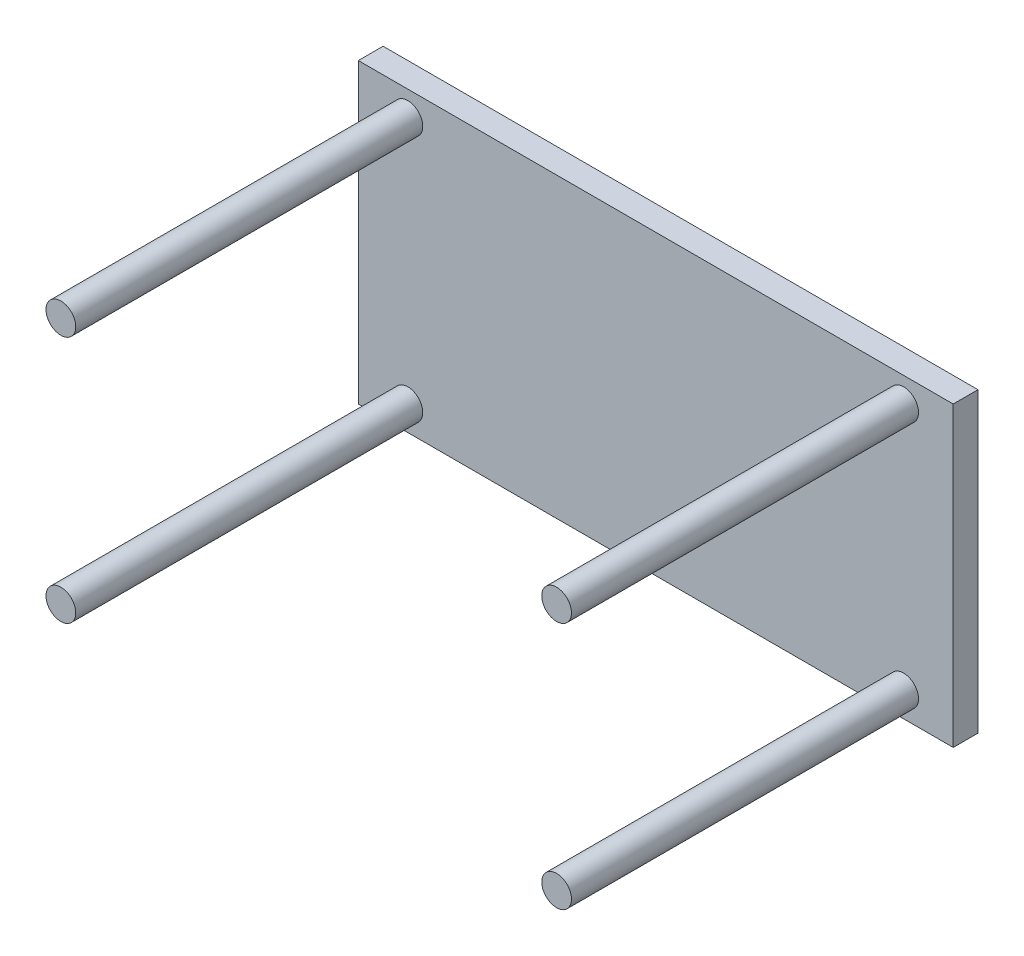
ISO-10303-21;
HEADER;
FILE_DESCRIPTION(('STEP AP214'),'2;1');
FILE_NAME('part.step','',(''),(''),'','','');
FILE_SCHEMA(('AUTOMOTIVE_DESIGN { 1 0 10303 214 1 1 1 1 }'));
ENDSEC;
DATA;
#1=APPLICATION_CONTEXT('core data for automotive mechanical design processes');
#2=APPLICATION_PROTOCOL_DEFINITION('international standard','automotive_design',2000,#1);
#3=PRODUCT_CONTEXT('',#1,'mechanical');
#4=PRODUCT('Part','Part','',(#3));
#5=PRODUCT_RELATED_PRODUCT_CATEGORY('part','',(#4));
#6=PRODUCT_DEFINITION_FORMATION('','',#4);
#7=PRODUCT_DEFINITION_CONTEXT('part definition',#1,'design');
#8=PRODUCT_DEFINITION('design','',#6,#7);
#9=PRODUCT_DEFINITION_SHAPE('','',#8);
#10=(LENGTH_UNIT() NAMED_UNIT(*) SI_UNIT(.MILLI.,.METRE.));
#11=(NAMED_UNIT(*) PLANE_ANGLE_UNIT() SI_UNIT($,.RADIAN.));
#12=(NAMED_UNIT(*) SI_UNIT($,.STERADIAN.) SOLID_ANGLE_UNIT());
#13=UNCERTAINTY_MEASURE_WITH_UNIT(LENGTH_MEASURE(1.E-05),#10,'distance_accuracy_value','');
#14=(GEOMETRIC_REPRESENTATION_CONTEXT(3) GLOBAL_UNCERTAINTY_ASSIGNED_CONTEXT((#13)) GLOBAL_UNIT_ASSIGNED_CONTEXT((#10,
#11,#12)) REPRESENTATION_CONTEXT('',''));
#15=CARTESIAN_POINT('',(0.,0.,0.));
#16=DIRECTION('',(0.,0.,1.));
#17=DIRECTION('',(1.,0.,0.));
#18=AXIS2_PLACEMENT_3D('',#15,#16,#17);
#19=CARTESIAN_POINT('',(600.,-300.,50.));
#20=DIRECTION('',(-1.,0.,0.));
#21=DIRECTION('',(0.,0.,1.));
#22=AXIS2_PLACEMENT_3D('',#19,#20,#21);
#23=PLANE('',#22);
#24=DIRECTION('',(0.,1.,0.));
#25=VECTOR('',#24,1.);
#26=CARTESIAN_POINT('',(600.,-300.,0.));
#27=LINE('',#26,#25);
#28=CARTESIAN_POINT('',(600.,-300.,0.));
#29=VERTEX_POINT('',#28);
#30=CARTESIAN_POINT('',(600.,300.,0.));
#31=VERTEX_POINT('',#30);
#32=EDGE_CURVE('E108',#29,#31,#27,.T.);
#33=ORIENTED_EDGE('',*,*,#32,.T.);
#34=DIRECTION('',(0.,0.,-1.));
#35=VECTOR('',#34,1.);
#36=CARTESIAN_POINT('',(600.,300.,50.));
#37=LINE('',#36,#35);
#38=CARTESIAN_POINT('',(600.,300.,50.));
#39=VERTEX_POINT('',#38);
#40=EDGE_CURVE('E44',#39,#31,#37,.T.);
#41=ORIENTED_EDGE('',*,*,#40,.F.);
#42=DIRECTION('',(0.,1.,0.));
#43=VECTOR('',#42,1.);
#44=CARTESIAN_POINT('',(600.,-300.,50.));
#45=LINE('',#44,#43);
#46=CARTESIAN_POINT('',(600.,-300.,50.));
#47=VERTEX_POINT('',#46);
#48=EDGE_CURVE('E95',#47,#39,#45,.T.);
#49=ORIENTED_EDGE('',*,*,#48,.F.);
#50=DIRECTION('',(0.,0.,-1.));
#51=VECTOR('',#50,1.);
#52=CARTESIAN_POINT('',(600.,-300.,50.));
#53=LINE('',#52,#51);
#54=EDGE_CURVE('E104',#47,#29,#53,.T.);
#55=ORIENTED_EDGE('',*,*,#54,.T.);
#56=EDGE_LOOP('',(#33,#41,#49,#55));
#57=FACE_BOUND('',#56,.T.);
#58=ADVANCED_FACE('F41',(#57),#23,.F.);
#59=CARTESIAN_POINT('',(-600.,300.,50.));
#60=DIRECTION('',(0.,-1.,0.));
#61=DIRECTION('',(0.,0.,-1.));
#62=AXIS2_PLACEMENT_3D('',#59,#60,#61);
#63=PLANE('',#62);
#64=DIRECTION('',(-1.,0.,0.));
#65=VECTOR('',#64,1.);
#66=CARTESIAN_POINT('',(-600.,300.,0.));
#67=LINE('',#66,#65);
#68=CARTESIAN_POINT('',(-600.,300.,0.));
#69=VERTEX_POINT('',#68);
#70=EDGE_CURVE('E100',#31,#69,#67,.T.);
#71=ORIENTED_EDGE('',*,*,#70,.T.);
#72=DIRECTION('',(0.,0.,-1.));
#73=VECTOR('',#72,1.);
#74=CARTESIAN_POINT('',(-600.,300.,50.));
#75=LINE('',#74,#73);
#76=CARTESIAN_POINT('',(-600.,300.,50.));
#77=VERTEX_POINT('',#76);
#78=EDGE_CURVE('E98',#77,#69,#75,.T.);
#79=ORIENTED_EDGE('',*,*,#78,.F.);
#80=DIRECTION('',(-1.,0.,0.));
#81=VECTOR('',#80,1.);
#82=CARTESIAN_POINT('',(-600.,300.,50.));
#83=LINE('',#82,#81);
#84=EDGE_CURVE('E90',#39,#77,#83,.T.);
#85=ORIENTED_EDGE('',*,*,#84,.F.);
#86=ORIENTED_EDGE('',*,*,#40,.T.);
#87=EDGE_LOOP('',(#71,#79,#85,#86));
#88=FACE_BOUND('',#87,.T.);
#89=ADVANCED_FACE('F99',(#88),#63,.F.);
#90=CARTESIAN_POINT('',(-600.,-300.,50.));
#91=DIRECTION('',(1.,0.,0.));
#92=DIRECTION('',(0.,0.,-1.));
#93=AXIS2_PLACEMENT_3D('',#90,#91,#92);
#94=PLANE('',#93);
#95=DIRECTION('',(0.,-1.,0.));
#96=VECTOR('',#95,1.);
#97=CARTESIAN_POINT('',(-600.,-300.,0.));
#98=LINE('',#97,#96);
#99=CARTESIAN_POINT('',(-600.,-300.,0.));
#100=VERTEX_POINT('',#99);
#101=EDGE_CURVE('E76',#69,#100,#98,.T.);
#102=ORIENTED_EDGE('',*,*,#101,.T.);
#103=DIRECTION('',(0.,0.,-1.));
#104=VECTOR('',#103,1.);
#105=CARTESIAN_POINT('',(-600.,-300.,50.));
#106=LINE('',#105,#104);
#107=CARTESIAN_POINT('',(-600.,-300.,50.));
#108=VERTEX_POINT('',#107);
#109=EDGE_CURVE('E101',#108,#100,#106,.T.);
#110=ORIENTED_EDGE('',*,*,#109,.F.);
#111=DIRECTION('',(0.,-1.,0.));
#112=VECTOR('',#111,1.);
#113=CARTESIAN_POINT('',(-600.,-300.,50.));
#114=LINE('',#113,#112);
#115=EDGE_CURVE('E93',#77,#108,#114,.T.);
#116=ORIENTED_EDGE('',*,*,#115,.F.);
#117=ORIENTED_EDGE('',*,*,#78,.T.);
#118=EDGE_LOOP('',(#102,#110,#116,#117));
#119=FACE_BOUND('',#118,.T.);
#120=ADVANCED_FACE('F102',(#119),#94,.F.);
#121=CARTESIAN_POINT('',(-600.,-300.,50.));
#122=DIRECTION('',(0.,1.,0.));
#123=DIRECTION('',(0.,0.,1.));
#124=AXIS2_PLACEMENT_3D('',#121,#122,#123);
#125=PLANE('',#124);
#126=DIRECTION('',(1.,0.,0.));
#127=VECTOR('',#126,1.);
#128=CARTESIAN_POINT('',(-600.,-300.,0.));
#129=LINE('',#128,#127);
#130=EDGE_CURVE('E82',#100,#29,#129,.T.);
#131=ORIENTED_EDGE('',*,*,#130,.T.);
#132=ORIENTED_EDGE('',*,*,#54,.F.);
#133=DIRECTION('',(1.,0.,0.));
#134=VECTOR('',#133,1.);
#135=CARTESIAN_POINT('',(-600.,-300.,50.));
#136=LINE('',#135,#134);
#137=EDGE_CURVE('E59',#108,#47,#136,.T.);
#138=ORIENTED_EDGE('',*,*,#137,.F.);
#139=ORIENTED_EDGE('',*,*,#109,.T.);
#140=EDGE_LOOP('',(#131,#132,#138,#139));
#141=FACE_BOUND('',#140,.T.);
#142=ADVANCED_FACE('F116',(#141),#125,.F.);
#143=CARTESIAN_POINT('',(0.,0.,50.));
#144=DIRECTION('',(0.,0.,-1.));
#145=DIRECTION('',(-1.,0.,0.));
#146=AXIS2_PLACEMENT_3D('',#143,#144,#145);
#147=PLANE('',#146);
#148=CARTESIAN_POINT('',(500.,250.,50.));
#149=DIRECTION('',(0.,0.,-1.));
#150=DIRECTION('',(-1.,0.,0.));
#151=AXIS2_PLACEMENT_3D('',#148,#149,#150);
#152=CIRCLE('',#151,30.0000000000001);
#153=CARTESIAN_POINT('',(470.,250.,50.));
#154=VERTEX_POINT('',#153);
#155=EDGE_CURVE('E11',#154,#154,#152,.F.);
#156=ORIENTED_EDGE('',*,*,#155,.F.);
#157=EDGE_LOOP('',(#156));
#158=FACE_BOUND('',#157,.T.);
#159=CARTESIAN_POINT('',(-500.,250.,50.));
#160=DIRECTION('',(0.,0.,-1.));
#161=DIRECTION('',(-1.,0.,0.));
#162=AXIS2_PLACEMENT_3D('',#159,#160,#161);
#163=CIRCLE('',#162,30.0000000000001);
#164=CARTESIAN_POINT('',(-530.,250.,50.));
#165=VERTEX_POINT('',#164);
#166=EDGE_CURVE('E50',#165,#165,#163,.F.);
#167=ORIENTED_EDGE('',*,*,#166,.F.);
#168=EDGE_LOOP('',(#167));
#169=FACE_BOUND('',#168,.T.);
#170=CARTESIAN_POINT('',(500.,-250.,50.));
#171=DIRECTION('',(0.,0.,-1.));
#172=DIRECTION('',(-1.,0.,0.));
#173=AXIS2_PLACEMENT_3D('',#170,#171,#172);
#174=CIRCLE('',#173,30.);
#175=CARTESIAN_POINT('',(470.,-250.,50.));
#176=VERTEX_POINT('',#175);
#177=EDGE_CURVE('E125',#176,#176,#174,.F.);
#178=ORIENTED_EDGE('',*,*,#177,.F.);
#179=EDGE_LOOP('',(#178));
#180=FACE_BOUND('',#179,.T.);
#181=CARTESIAN_POINT('',(-500.,-250.,50.));
#182=DIRECTION('',(0.,0.,-1.));
#183=DIRECTION('',(-1.,0.,0.));
#184=AXIS2_PLACEMENT_3D('',#181,#182,#183);
#185=CIRCLE('',#184,30.);
#186=CARTESIAN_POINT('',(-530.,-250.,50.));
#187=VERTEX_POINT('',#186);
#188=EDGE_CURVE('E122',#187,#187,#185,.F.);
#189=ORIENTED_EDGE('',*,*,#188,.F.);
#190=EDGE_LOOP('',(#189));
#191=FACE_BOUND('',#190,.T.);
#192=ORIENTED_EDGE('',*,*,#48,.T.);
#193=ORIENTED_EDGE('',*,*,#84,.T.);
#194=ORIENTED_EDGE('',*,*,#115,.T.);
#195=ORIENTED_EDGE('',*,*,#137,.T.);
#196=EDGE_LOOP('',(#192,#193,#194,#195));
#197=FACE_BOUND('',#196,.T.);
#198=ADVANCED_FACE('F91',(#158,#169,#180,#191,#197),#147,.F.);
#199=CARTESIAN_POINT('',(0.,0.,0.));
#200=DIRECTION('',(0.,0.,-1.));
#201=DIRECTION('',(-1.,0.,0.));
#202=AXIS2_PLACEMENT_3D('',#199,#200,#201);
#203=PLANE('',#202);
#204=ORIENTED_EDGE('',*,*,#32,.F.);
#205=ORIENTED_EDGE('',*,*,#130,.F.);
#206=ORIENTED_EDGE('',*,*,#101,.F.);
#207=ORIENTED_EDGE('',*,*,#70,.F.);
#208=EDGE_LOOP('',(#204,#205,#206,#207));
#209=FACE_BOUND('',#208,.T.);
#210=ADVANCED_FACE('F119',(#209),#203,.T.);
#211=CARTESIAN_POINT('',(-500.,-250.,750.));
#212=DIRECTION('',(0.,0.,-1.));
#213=DIRECTION('',(-1.,0.,0.));
#214=AXIS2_PLACEMENT_3D('',#211,#212,#213);
#215=CYLINDRICAL_SURFACE('',#214,30.);
#216=CARTESIAN_POINT('',(-500.,-250.,750.));
#217=DIRECTION('',(0.,0.,1.));
#218=DIRECTION('',(1.,0.,0.));
#219=AXIS2_PLACEMENT_3D('',#216,#217,#218);
#220=CIRCLE('',#219,30.);
#221=CARTESIAN_POINT('',(-470.,-250.,750.));
#222=VERTEX_POINT('',#221);
#223=EDGE_CURVE('E111',#222,#222,#220,.T.);
#224=ORIENTED_EDGE('',*,*,#223,.F.);
#225=EDGE_LOOP('',(#224));
#226=FACE_BOUND('',#225,.T.);
#227=ORIENTED_EDGE('',*,*,#188,.T.);
#228=EDGE_LOOP('',(#227));
#229=FACE_BOUND('',#228,.T.);
#230=ADVANCED_FACE('F160',(#226,#229),#215,.T.);
#231=CARTESIAN_POINT('',(-500.,-250.,750.));
#232=DIRECTION('',(0.,0.,1.));
#233=DIRECTION('',(1.,0.,0.));
#234=AXIS2_PLACEMENT_3D('',#231,#232,#233);
#235=PLANE('',#234);
#236=ORIENTED_EDGE('',*,*,#223,.T.);
#237=EDGE_LOOP('',(#236));
#238=FACE_BOUND('',#237,.T.);
#239=ADVANCED_FACE('F162',(#238),#235,.T.);
#240=CARTESIAN_POINT('',(500.,-250.,750.));
#241=DIRECTION('',(0.,0.,-1.));
#242=DIRECTION('',(-1.,0.,0.));
#243=AXIS2_PLACEMENT_3D('',#240,#241,#242);
#244=CYLINDRICAL_SURFACE('',#243,30.);
#245=CARTESIAN_POINT('',(500.,-250.,750.));
#246=DIRECTION('',(0.,0.,1.));
#247=DIRECTION('',(1.,0.,0.));
#248=AXIS2_PLACEMENT_3D('',#245,#246,#247);
#249=CIRCLE('',#248,30.);
#250=CARTESIAN_POINT('',(530.,-250.,750.));
#251=VERTEX_POINT('',#250);
#252=EDGE_CURVE('E128',#251,#251,#249,.T.);
#253=ORIENTED_EDGE('',*,*,#252,.F.);
#254=EDGE_LOOP('',(#253));
#255=FACE_BOUND('',#254,.T.);
#256=ORIENTED_EDGE('',*,*,#177,.T.);
#257=EDGE_LOOP('',(#256));
#258=FACE_BOUND('',#257,.T.);
#259=ADVANCED_FACE('F169',(#255,#258),#244,.T.);
#260=CARTESIAN_POINT('',(500.,-250.,750.));
#261=DIRECTION('',(0.,0.,1.));
#262=DIRECTION('',(1.,0.,0.));
#263=AXIS2_PLACEMENT_3D('',#260,#261,#262);
#264=PLANE('',#263);
#265=ORIENTED_EDGE('',*,*,#252,.T.);
#266=EDGE_LOOP('',(#265));
#267=FACE_BOUND('',#266,.T.);
#268=ADVANCED_FACE('F228',(#267),#264,.T.);
#269=CARTESIAN_POINT('',(-500.,250.,750.));
#270=DIRECTION('',(0.,0.,-1.));
#271=DIRECTION('',(-1.,0.,0.));
#272=AXIS2_PLACEMENT_3D('',#269,#270,#271);
#273=CYLINDRICAL_SURFACE('',#272,30.0000000000001);
#274=CARTESIAN_POINT('',(-500.,250.,750.));
#275=DIRECTION('',(0.,0.,1.));
#276=DIRECTION('',(1.,0.,0.));
#277=AXIS2_PLACEMENT_3D('',#274,#275,#276);
#278=CIRCLE('',#277,30.0000000000001);
#279=CARTESIAN_POINT('',(-470.,250.,750.));
#280=VERTEX_POINT('',#279);
#281=EDGE_CURVE('E133',#280,#280,#278,.T.);
#282=ORIENTED_EDGE('',*,*,#281,.F.);
#283=EDGE_LOOP('',(#282));
#284=FACE_BOUND('',#283,.T.);
#285=ORIENTED_EDGE('',*,*,#166,.T.);
#286=EDGE_LOOP('',(#285));
#287=FACE_BOUND('',#286,.T.);
#288=ADVANCED_FACE('F237',(#284,#287),#273,.T.);
#289=CARTESIAN_POINT('',(-500.,250.,750.));
#290=DIRECTION('',(0.,0.,1.));
#291=DIRECTION('',(1.,0.,0.));
#292=AXIS2_PLACEMENT_3D('',#289,#290,#291);
#293=PLANE('',#292);
#294=ORIENTED_EDGE('',*,*,#281,.T.);
#295=EDGE_LOOP('',(#294));
#296=FACE_BOUND('',#295,.T.);
#297=ADVANCED_FACE('F147',(#296),#293,.T.);
#298=CARTESIAN_POINT('',(500.,250.,750.));
#299=DIRECTION('',(0.,0.,-1.));
#300=DIRECTION('',(-1.,0.,0.));
#301=AXIS2_PLACEMENT_3D('',#298,#299,#300);
#302=CYLINDRICAL_SURFACE('',#301,30.0000000000001);
#303=CARTESIAN_POINT('',(500.,250.,750.));
#304=DIRECTION('',(0.,0.,1.));
#305=DIRECTION('',(1.,0.,0.));
#306=AXIS2_PLACEMENT_3D('',#303,#304,#305);
#307=CIRCLE('',#306,30.0000000000001);
#308=CARTESIAN_POINT('',(530.,250.,750.));
#309=VERTEX_POINT('',#308);
#310=EDGE_CURVE('E137',#309,#309,#307,.T.);
#311=ORIENTED_EDGE('',*,*,#310,.F.);
#312=EDGE_LOOP('',(#311));
#313=FACE_BOUND('',#312,.T.);
#314=ORIENTED_EDGE('',*,*,#155,.T.);
#315=EDGE_LOOP('',(#314));
#316=FACE_BOUND('',#315,.T.);
#317=ADVANCED_FACE('F144',(#313,#316),#302,.T.);
#318=CARTESIAN_POINT('',(500.,250.,750.));
#319=DIRECTION('',(0.,0.,1.));
#320=DIRECTION('',(1.,0.,0.));
#321=AXIS2_PLACEMENT_3D('',#318,#319,#320);
#322=PLANE('',#321);
#323=ORIENTED_EDGE('',*,*,#310,.T.);
#324=EDGE_LOOP('',(#323));
#325=FACE_BOUND('',#324,.T.);
#326=ADVANCED_FACE('F142',(#325),#322,.T.);
#327=CLOSED_SHELL('',(#58,#89,#120,#142,#198,#210,#230,#239,#259,#268,#288,#297,#317,#326));
#328=MANIFOLD_SOLID_BREP('B2',#327);
#329=ADVANCED_BREP_SHAPE_REPRESENTATION('',(#18,#328),#14);
#330=SHAPE_DEFINITION_REPRESENTATION(#9,#329);
ENDSEC;
END-ISO-10303-21;
